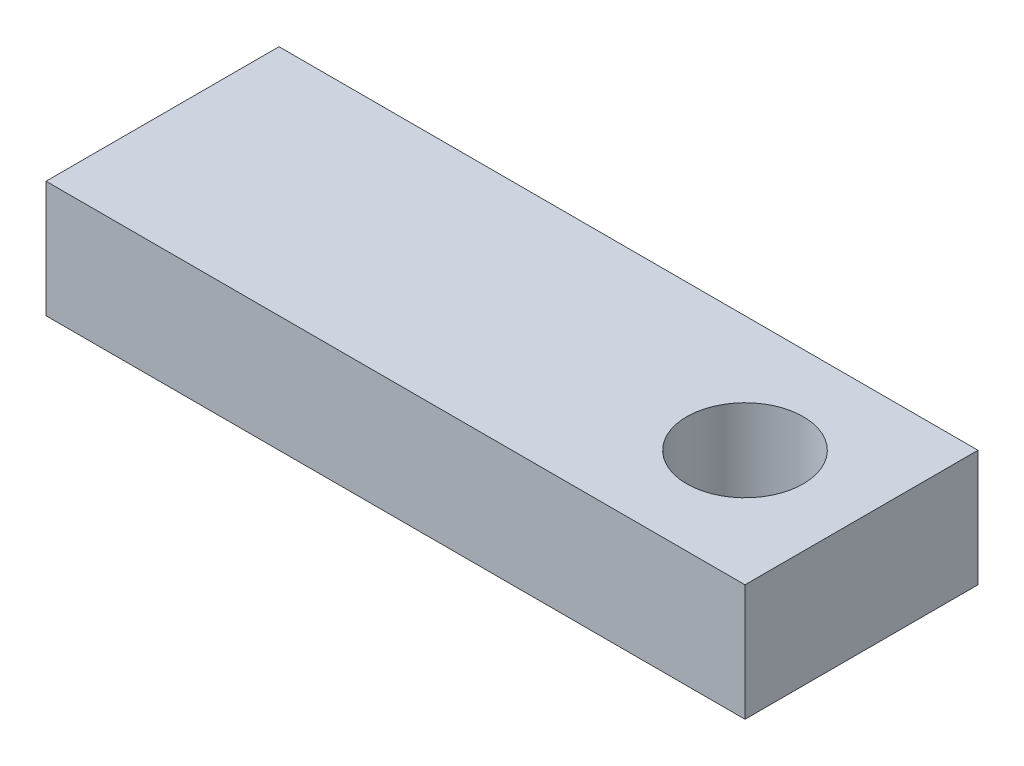
ISO-10303-21;
HEADER;
FILE_DESCRIPTION(('STEP AP214'),'2;1');
FILE_NAME('part.step','',(''),(''),'','','');
FILE_SCHEMA(('AUTOMOTIVE_DESIGN { 1 0 10303 214 1 1 1 1 }'));
ENDSEC;
DATA;
#1=APPLICATION_CONTEXT('core data for automotive mechanical design processes');
#2=APPLICATION_PROTOCOL_DEFINITION('international standard','automotive_design',2000,#1);
#3=PRODUCT_CONTEXT('',#1,'mechanical');
#4=PRODUCT('Part','Part','',(#3));
#5=PRODUCT_RELATED_PRODUCT_CATEGORY('part','',(#4));
#6=PRODUCT_DEFINITION_FORMATION('','',#4);
#7=PRODUCT_DEFINITION_CONTEXT('part definition',#1,'design');
#8=PRODUCT_DEFINITION('design','',#6,#7);
#9=PRODUCT_DEFINITION_SHAPE('','',#8);
#10=(LENGTH_UNIT() NAMED_UNIT(*) SI_UNIT(.MILLI.,.METRE.));
#11=(NAMED_UNIT(*) PLANE_ANGLE_UNIT() SI_UNIT($,.RADIAN.));
#12=(NAMED_UNIT(*) SI_UNIT($,.STERADIAN.) SOLID_ANGLE_UNIT());
#13=UNCERTAINTY_MEASURE_WITH_UNIT(LENGTH_MEASURE(1.E-05),#10,'distance_accuracy_value','');
#14=(GEOMETRIC_REPRESENTATION_CONTEXT(3) GLOBAL_UNCERTAINTY_ASSIGNED_CONTEXT((#13)) GLOBAL_UNIT_ASSIGNED_CONTEXT((#10,
#11,#12)) REPRESENTATION_CONTEXT('',''));
#15=CARTESIAN_POINT('',(0.,0.,0.));
#16=DIRECTION('',(0.,0.,1.));
#17=DIRECTION('',(1.,0.,0.));
#18=AXIS2_PLACEMENT_3D('',#15,#16,#17);
#19=CARTESIAN_POINT('',(0.,12.7,12.7));
#20=DIRECTION('',(0.,0.,-1.));
#21=DIRECTION('',(-1.,0.,0.));
#22=AXIS2_PLACEMENT_3D('',#19,#20,#21);
#23=PLANE('',#22);
#24=DIRECTION('',(1.,0.,0.));
#25=VECTOR('',#24,1.);
#26=CARTESIAN_POINT('',(0.,0.,12.7));
#27=LINE('',#26,#25);
#28=CARTESIAN_POINT('',(-38.1,0.,12.7));
#29=VERTEX_POINT('',#28);
#30=CARTESIAN_POINT('',(38.1,0.,12.7));
#31=VERTEX_POINT('',#30);
#32=EDGE_CURVE('E118',#29,#31,#27,.T.);
#33=ORIENTED_EDGE('',*,*,#32,.T.);
#34=DIRECTION('',(0.,-1.,0.));
#35=VECTOR('',#34,1.);
#36=CARTESIAN_POINT('',(38.1,12.7,12.7));
#37=LINE('',#36,#35);
#38=CARTESIAN_POINT('',(38.1,12.7,12.7));
#39=VERTEX_POINT('',#38);
#40=EDGE_CURVE('E11',#39,#31,#37,.T.);
#41=ORIENTED_EDGE('',*,*,#40,.F.);
#42=DIRECTION('',(1.,0.,0.));
#43=VECTOR('',#42,1.);
#44=CARTESIAN_POINT('',(0.,12.7,12.7));
#45=LINE('',#44,#43);
#46=CARTESIAN_POINT('',(-38.1,12.7,12.7));
#47=VERTEX_POINT('',#46);
#48=EDGE_CURVE('E96',#47,#39,#45,.T.);
#49=ORIENTED_EDGE('',*,*,#48,.F.);
#50=DIRECTION('',(0.,-1.,0.));
#51=VECTOR('',#50,1.);
#52=CARTESIAN_POINT('',(-38.1,12.7,12.7));
#53=LINE('',#52,#51);
#54=EDGE_CURVE('E63',#47,#29,#53,.T.);
#55=ORIENTED_EDGE('',*,*,#54,.T.);
#56=EDGE_LOOP('',(#33,#41,#49,#55));
#57=FACE_BOUND('',#56,.T.);
#58=ADVANCED_FACE('F45',(#57),#23,.F.);
#59=CARTESIAN_POINT('',(38.1,12.7,0.));
#60=DIRECTION('',(-1.,0.,0.));
#61=DIRECTION('',(0.,0.,1.));
#62=AXIS2_PLACEMENT_3D('',#59,#60,#61);
#63=PLANE('',#62);
#64=DIRECTION('',(0.,0.,-1.));
#65=VECTOR('',#64,1.);
#66=CARTESIAN_POINT('',(38.1,0.,0.));
#67=LINE('',#66,#65);
#68=CARTESIAN_POINT('',(38.1,0.,-12.7));
#69=VERTEX_POINT('',#68);
#70=EDGE_CURVE('E102',#31,#69,#67,.T.);
#71=ORIENTED_EDGE('',*,*,#70,.T.);
#72=DIRECTION('',(0.,-1.,0.));
#73=VECTOR('',#72,1.);
#74=CARTESIAN_POINT('',(38.1,12.7,-12.7));
#75=LINE('',#74,#73);
#76=CARTESIAN_POINT('',(38.1,12.7,-12.7));
#77=VERTEX_POINT('',#76);
#78=EDGE_CURVE('E55',#77,#69,#75,.T.);
#79=ORIENTED_EDGE('',*,*,#78,.F.);
#80=DIRECTION('',(0.,0.,-1.));
#81=VECTOR('',#80,1.);
#82=CARTESIAN_POINT('',(38.1,12.7,0.));
#83=LINE('',#82,#81);
#84=EDGE_CURVE('E88',#39,#77,#83,.T.);
#85=ORIENTED_EDGE('',*,*,#84,.F.);
#86=ORIENTED_EDGE('',*,*,#40,.T.);
#87=EDGE_LOOP('',(#71,#79,#85,#86));
#88=FACE_BOUND('',#87,.T.);
#89=ADVANCED_FACE('F101',(#88),#63,.F.);
#90=CARTESIAN_POINT('',(0.,12.7,-12.7));
#91=DIRECTION('',(0.,0.,-1.));
#92=DIRECTION('',(-1.,0.,0.));
#93=AXIS2_PLACEMENT_3D('',#90,#91,#92);
#94=PLANE('',#93);
#95=DIRECTION('',(1.,0.,0.));
#96=VECTOR('',#95,1.);
#97=CARTESIAN_POINT('',(0.,0.,-12.7));
#98=LINE('',#97,#96);
#99=CARTESIAN_POINT('',(-38.1,0.,-12.7));
#100=VERTEX_POINT('',#99);
#101=EDGE_CURVE('E123',#100,#69,#98,.T.);
#102=ORIENTED_EDGE('',*,*,#101,.F.);
#103=DIRECTION('',(0.,-1.,0.));
#104=VECTOR('',#103,1.);
#105=CARTESIAN_POINT('',(-38.1,12.7,-12.7));
#106=LINE('',#105,#104);
#107=CARTESIAN_POINT('',(-38.1,12.7,-12.7));
#108=VERTEX_POINT('',#107);
#109=EDGE_CURVE('E77',#108,#100,#106,.T.);
#110=ORIENTED_EDGE('',*,*,#109,.F.);
#111=DIRECTION('',(1.,0.,0.));
#112=VECTOR('',#111,1.);
#113=CARTESIAN_POINT('',(0.,12.7,-12.7));
#114=LINE('',#113,#112);
#115=EDGE_CURVE('E95',#108,#77,#114,.T.);
#116=ORIENTED_EDGE('',*,*,#115,.T.);
#117=ORIENTED_EDGE('',*,*,#78,.T.);
#118=EDGE_LOOP('',(#102,#110,#116,#117));
#119=FACE_BOUND('',#118,.T.);
#120=ADVANCED_FACE('F106',(#119),#94,.T.);
#121=CARTESIAN_POINT('',(25.4,12.7,0.));
#122=DIRECTION('',(0.,-1.,0.));
#123=DIRECTION('',(0.,0.,-1.));
#124=AXIS2_PLACEMENT_3D('',#121,#122,#123);
#125=CYLINDRICAL_SURFACE('',#124,6.35000000000001);
#126=CARTESIAN_POINT('',(25.4,12.7,0.));
#127=DIRECTION('',(0.,1.,0.));
#128=DIRECTION('',(0.,0.,1.));
#129=AXIS2_PLACEMENT_3D('',#126,#127,#128);
#130=CIRCLE('',#129,6.35000000000001);
#131=CARTESIAN_POINT('',(25.4,12.7,6.35000000000001));
#132=VERTEX_POINT('',#131);
#133=EDGE_CURVE('E130',#132,#132,#130,.T.);
#134=ORIENTED_EDGE('',*,*,#133,.T.);
#135=EDGE_LOOP('',(#134));
#136=FACE_BOUND('',#135,.T.);
#137=CARTESIAN_POINT('',(25.4,0.,0.));
#138=DIRECTION('',(0.,1.,0.));
#139=DIRECTION('',(0.,0.,1.));
#140=AXIS2_PLACEMENT_3D('',#137,#138,#139);
#141=CIRCLE('',#140,6.35000000000001);
#142=CARTESIAN_POINT('',(25.4,0.,6.35000000000001));
#143=VERTEX_POINT('',#142);
#144=EDGE_CURVE('E114',#143,#143,#141,.T.);
#145=ORIENTED_EDGE('',*,*,#144,.F.);
#146=EDGE_LOOP('',(#145));
#147=FACE_BOUND('',#146,.T.);
#148=ADVANCED_FACE('F47',(#136,#147),#125,.F.);
#149=CARTESIAN_POINT('',(-38.1,12.7,0.));
#150=DIRECTION('',(-1.,0.,0.));
#151=DIRECTION('',(0.,0.,1.));
#152=AXIS2_PLACEMENT_3D('',#149,#150,#151);
#153=PLANE('',#152);
#154=DIRECTION('',(0.,0.,-1.));
#155=VECTOR('',#154,1.);
#156=CARTESIAN_POINT('',(-38.1,0.,0.));
#157=LINE('',#156,#155);
#158=EDGE_CURVE('E126',#29,#100,#157,.T.);
#159=ORIENTED_EDGE('',*,*,#158,.F.);
#160=ORIENTED_EDGE('',*,*,#54,.F.);
#161=DIRECTION('',(0.,0.,-1.));
#162=VECTOR('',#161,1.);
#163=CARTESIAN_POINT('',(-38.1,12.7,0.));
#164=LINE('',#163,#162);
#165=EDGE_CURVE('E108',#47,#108,#164,.T.);
#166=ORIENTED_EDGE('',*,*,#165,.T.);
#167=ORIENTED_EDGE('',*,*,#109,.T.);
#168=EDGE_LOOP('',(#159,#160,#166,#167));
#169=FACE_BOUND('',#168,.T.);
#170=ADVANCED_FACE('F145',(#169),#153,.T.);
#171=CARTESIAN_POINT('',(0.,12.7,0.));
#172=DIRECTION('',(0.,1.,0.));
#173=DIRECTION('',(0.,0.,1.));
#174=AXIS2_PLACEMENT_3D('',#171,#172,#173);
#175=PLANE('',#174);
#176=ORIENTED_EDGE('',*,*,#133,.F.);
#177=EDGE_LOOP('',(#176));
#178=FACE_BOUND('',#177,.T.);
#179=ORIENTED_EDGE('',*,*,#48,.T.);
#180=ORIENTED_EDGE('',*,*,#84,.T.);
#181=ORIENTED_EDGE('',*,*,#115,.F.);
#182=ORIENTED_EDGE('',*,*,#165,.F.);
#183=EDGE_LOOP('',(#179,#180,#181,#182));
#184=FACE_BOUND('',#183,.T.);
#185=ADVANCED_FACE('F92',(#178,#184),#175,.T.);
#186=CARTESIAN_POINT('',(0.,0.,0.));
#187=DIRECTION('',(0.,1.,0.));
#188=DIRECTION('',(0.,0.,1.));
#189=AXIS2_PLACEMENT_3D('',#186,#187,#188);
#190=PLANE('',#189);
#191=ORIENTED_EDGE('',*,*,#144,.T.);
#192=EDGE_LOOP('',(#191));
#193=FACE_BOUND('',#192,.T.);
#194=ORIENTED_EDGE('',*,*,#32,.F.);
#195=ORIENTED_EDGE('',*,*,#158,.T.);
#196=ORIENTED_EDGE('',*,*,#101,.T.);
#197=ORIENTED_EDGE('',*,*,#70,.F.);
#198=EDGE_LOOP('',(#194,#195,#196,#197));
#199=FACE_BOUND('',#198,.T.);
#200=ADVANCED_FACE('F144',(#193,#199),#190,.F.);
#201=CLOSED_SHELL('',(#58,#89,#120,#148,#170,#185,#200));
#202=MANIFOLD_SOLID_BREP('B2',#201);
#203=ADVANCED_BREP_SHAPE_REPRESENTATION('',(#18,#202),#14);
#204=SHAPE_DEFINITION_REPRESENTATION(#9,#203);
ENDSEC;
END-ISO-10303-21;
